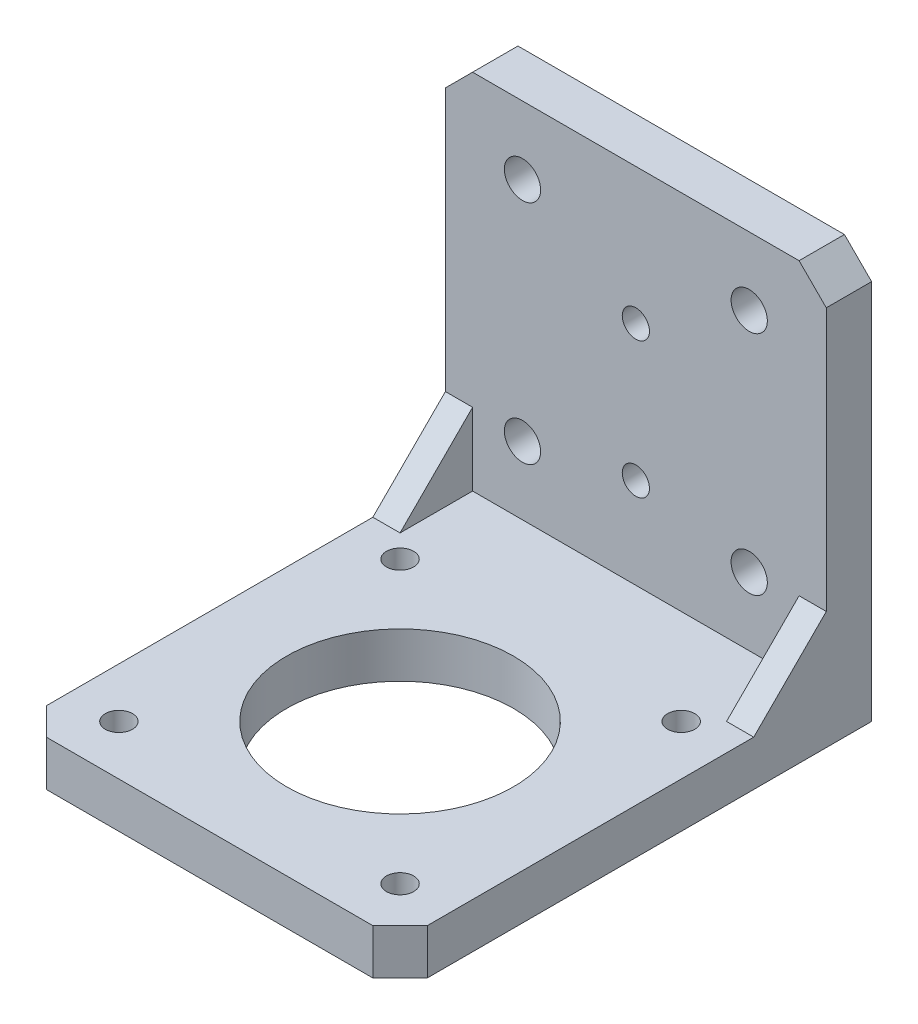
ISO-10303-21;
HEADER;
FILE_DESCRIPTION(('STEP AP214'),'2;1');
FILE_NAME('part.step','',(''),(''),'','','');
FILE_SCHEMA(('AUTOMOTIVE_DESIGN { 1 0 10303 214 1 1 1 1 }'));
ENDSEC;
DATA;
#1=APPLICATION_CONTEXT('core data for automotive mechanical design processes');
#2=APPLICATION_PROTOCOL_DEFINITION('international standard','automotive_design',2000,#1);
#3=PRODUCT_CONTEXT('',#1,'mechanical');
#4=PRODUCT('Part','Part','',(#3));
#5=PRODUCT_RELATED_PRODUCT_CATEGORY('part','',(#4));
#6=PRODUCT_DEFINITION_FORMATION('','',#4);
#7=PRODUCT_DEFINITION_CONTEXT('part definition',#1,'design');
#8=PRODUCT_DEFINITION('design','',#6,#7);
#9=PRODUCT_DEFINITION_SHAPE('','',#8);
#10=(LENGTH_UNIT() NAMED_UNIT(*) SI_UNIT(.MILLI.,.METRE.));
#11=(NAMED_UNIT(*) PLANE_ANGLE_UNIT() SI_UNIT($,.RADIAN.));
#12=(NAMED_UNIT(*) SI_UNIT($,.STERADIAN.) SOLID_ANGLE_UNIT());
#13=UNCERTAINTY_MEASURE_WITH_UNIT(LENGTH_MEASURE(1.E-05),#10,'distance_accuracy_value','');
#14=(GEOMETRIC_REPRESENTATION_CONTEXT(3) GLOBAL_UNCERTAINTY_ASSIGNED_CONTEXT((#13)) GLOBAL_UNIT_ASSIGNED_CONTEXT((#10,
#11,#12)) REPRESENTATION_CONTEXT('',''));
#15=CARTESIAN_POINT('',(0.,0.,0.));
#16=DIRECTION('',(0.,0.,1.));
#17=DIRECTION('',(1.,0.,0.));
#18=AXIS2_PLACEMENT_3D('',#15,#16,#17);
#19=CARTESIAN_POINT('',(21.,5.,23.5));
#20=DIRECTION('',(-1.,0.,0.));
#21=DIRECTION('',(0.,0.,1.));
#22=AXIS2_PLACEMENT_3D('',#19,#20,#21);
#23=PLANE('',#22);
#24=DIRECTION('',(0.,0.,-1.));
#25=VECTOR('',#24,1.);
#26=CARTESIAN_POINT('',(21.,5.,23.5));
#27=LINE('',#26,#25);
#28=CARTESIAN_POINT('',(21.,5.,20.5));
#29=VERTEX_POINT('',#28);
#30=CARTESIAN_POINT('',(21.,5.,-15.5));
#31=VERTEX_POINT('',#30);
#32=EDGE_CURVE('E165',#29,#31,#27,.T.);
#33=ORIENTED_EDGE('',*,*,#32,.F.);
#34=DIRECTION('',(0.,-1.,0.));
#35=VECTOR('',#34,1.);
#36=CARTESIAN_POINT('',(21.,5.,20.5));
#37=LINE('',#36,#35);
#38=CARTESIAN_POINT('',(21.,0.,20.5));
#39=VERTEX_POINT('',#38);
#40=EDGE_CURVE('E328',#29,#39,#37,.T.);
#41=ORIENTED_EDGE('',*,*,#40,.T.);
#42=DIRECTION('',(0.,0.,-1.));
#43=VECTOR('',#42,1.);
#44=CARTESIAN_POINT('',(21.,0.,23.5));
#45=LINE('',#44,#43);
#46=CARTESIAN_POINT('',(21.,0.,-28.5));
#47=VERTEX_POINT('',#46);
#48=EDGE_CURVE('E186',#39,#47,#45,.T.);
#49=ORIENTED_EDGE('',*,*,#48,.T.);
#50=DIRECTION('',(0.,-1.,0.));
#51=VECTOR('',#50,1.);
#52=CARTESIAN_POINT('',(21.,0.,-28.5));
#53=LINE('',#52,#51);
#54=CARTESIAN_POINT('',(21.,42.,-28.5));
#55=VERTEX_POINT('',#54);
#56=EDGE_CURVE('E226',#55,#47,#53,.T.);
#57=ORIENTED_EDGE('',*,*,#56,.F.);
#58=DIRECTION('',(0.,0.,1.));
#59=VECTOR('',#58,1.);
#60=CARTESIAN_POINT('',(21.,42.,23.5));
#61=LINE('',#60,#59);
#62=CARTESIAN_POINT('',(21.,42.,-23.5));
#63=VERTEX_POINT('',#62);
#64=EDGE_CURVE('E212',#55,#63,#61,.T.);
#65=ORIENTED_EDGE('',*,*,#64,.T.);
#66=DIRECTION('',(0.,-1.,0.));
#67=VECTOR('',#66,1.);
#68=CARTESIAN_POINT('',(21.,0.,-23.5));
#69=LINE('',#68,#67);
#70=CARTESIAN_POINT('',(21.,13.,-23.5));
#71=VERTEX_POINT('',#70);
#72=EDGE_CURVE('E213',#63,#71,#69,.T.);
#73=ORIENTED_EDGE('',*,*,#72,.T.);
#74=DIRECTION('',(0.,-0.707106781186547,0.707106781186548));
#75=VECTOR('',#74,1.);
#76=CARTESIAN_POINT('',(21.,13.,-23.5));
#77=LINE('',#76,#75);
#78=EDGE_CURVE('E344',#71,#31,#77,.T.);
#79=ORIENTED_EDGE('',*,*,#78,.T.);
#80=EDGE_LOOP('',(#33,#41,#49,#57,#65,#73,#79));
#81=FACE_BOUND('',#80,.T.);
#82=ADVANCED_FACE('F35',(#81),#23,.F.);
#83=CARTESIAN_POINT('',(-21.,5.,23.5));
#84=DIRECTION('',(1.,0.,0.));
#85=DIRECTION('',(0.,0.,-1.));
#86=AXIS2_PLACEMENT_3D('',#83,#84,#85);
#87=PLANE('',#86);
#88=DIRECTION('',(0.,0.,1.));
#89=VECTOR('',#88,1.);
#90=CARTESIAN_POINT('',(-21.,0.,23.5));
#91=LINE('',#90,#89);
#92=CARTESIAN_POINT('',(-21.,0.,-28.5));
#93=VERTEX_POINT('',#92);
#94=CARTESIAN_POINT('',(-21.,0.,20.5));
#95=VERTEX_POINT('',#94);
#96=EDGE_CURVE('E189',#93,#95,#91,.T.);
#97=ORIENTED_EDGE('',*,*,#96,.T.);
#98=DIRECTION('',(0.,1.,0.));
#99=VECTOR('',#98,1.);
#100=CARTESIAN_POINT('',(-21.,5.,20.5));
#101=LINE('',#100,#99);
#102=CARTESIAN_POINT('',(-21.,5.,20.5));
#103=VERTEX_POINT('',#102);
#104=EDGE_CURVE('E206',#95,#103,#101,.T.);
#105=ORIENTED_EDGE('',*,*,#104,.T.);
#106=DIRECTION('',(0.,0.,1.));
#107=VECTOR('',#106,1.);
#108=CARTESIAN_POINT('',(-21.,5.,23.5));
#109=LINE('',#108,#107);
#110=CARTESIAN_POINT('',(-21.,5.,-15.5));
#111=VERTEX_POINT('',#110);
#112=EDGE_CURVE('E164',#111,#103,#109,.T.);
#113=ORIENTED_EDGE('',*,*,#112,.F.);
#114=DIRECTION('',(0.,0.707106781186548,-0.707106781186548));
#115=VECTOR('',#114,1.);
#116=CARTESIAN_POINT('',(-21.,13.,-23.5));
#117=LINE('',#116,#115);
#118=CARTESIAN_POINT('',(-21.,13.,-23.5));
#119=VERTEX_POINT('',#118);
#120=EDGE_CURVE('E156',#111,#119,#117,.T.);
#121=ORIENTED_EDGE('',*,*,#120,.T.);
#122=DIRECTION('',(0.,1.,0.));
#123=VECTOR('',#122,1.);
#124=CARTESIAN_POINT('',(-21.,0.,-23.5));
#125=LINE('',#124,#123);
#126=CARTESIAN_POINT('',(-21.,42.,-23.5));
#127=VERTEX_POINT('',#126);
#128=EDGE_CURVE('E176',#119,#127,#125,.T.);
#129=ORIENTED_EDGE('',*,*,#128,.T.);
#130=DIRECTION('',(0.,0.,-1.));
#131=VECTOR('',#130,1.);
#132=CARTESIAN_POINT('',(-21.,42.,23.5));
#133=LINE('',#132,#131);
#134=CARTESIAN_POINT('',(-21.,42.,-28.5));
#135=VERTEX_POINT('',#134);
#136=EDGE_CURVE('E204',#127,#135,#133,.T.);
#137=ORIENTED_EDGE('',*,*,#136,.T.);
#138=DIRECTION('',(0.,1.,0.));
#139=VECTOR('',#138,1.);
#140=CARTESIAN_POINT('',(-21.,0.,-28.5));
#141=LINE('',#140,#139);
#142=EDGE_CURVE('E312',#93,#135,#141,.T.);
#143=ORIENTED_EDGE('',*,*,#142,.F.);
#144=EDGE_LOOP('',(#97,#105,#113,#121,#129,#137,#143));
#145=FACE_BOUND('',#144,.T.);
#146=ADVANCED_FACE('F269',(#145),#87,.F.);
#147=CARTESIAN_POINT('',(-21.,5.,23.5));
#148=DIRECTION('',(0.,0.,-1.));
#149=DIRECTION('',(-1.,0.,0.));
#150=AXIS2_PLACEMENT_3D('',#147,#148,#149);
#151=PLANE('',#150);
#152=DIRECTION('',(1.,0.,0.));
#153=VECTOR('',#152,1.);
#154=CARTESIAN_POINT('',(-21.,5.,23.5));
#155=LINE('',#154,#153);
#156=CARTESIAN_POINT('',(-18.,5.,23.5));
#157=VERTEX_POINT('',#156);
#158=CARTESIAN_POINT('',(18.,5.,23.5));
#159=VERTEX_POINT('',#158);
#160=EDGE_CURVE('E167',#157,#159,#155,.T.);
#161=ORIENTED_EDGE('',*,*,#160,.F.);
#162=DIRECTION('',(0.,-1.,0.));
#163=VECTOR('',#162,1.);
#164=CARTESIAN_POINT('',(-18.,5.,23.5));
#165=LINE('',#164,#163);
#166=CARTESIAN_POINT('',(-18.,0.,23.5));
#167=VERTEX_POINT('',#166);
#168=EDGE_CURVE('E197',#157,#167,#165,.T.);
#169=ORIENTED_EDGE('',*,*,#168,.T.);
#170=DIRECTION('',(1.,0.,0.));
#171=VECTOR('',#170,1.);
#172=CARTESIAN_POINT('',(-21.,0.,23.5));
#173=LINE('',#172,#171);
#174=CARTESIAN_POINT('',(18.,0.,23.5));
#175=VERTEX_POINT('',#174);
#176=EDGE_CURVE('E169',#167,#175,#173,.T.);
#177=ORIENTED_EDGE('',*,*,#176,.T.);
#178=DIRECTION('',(0.,1.,0.));
#179=VECTOR('',#178,1.);
#180=CARTESIAN_POINT('',(18.,5.,23.5));
#181=LINE('',#180,#179);
#182=EDGE_CURVE('E185',#175,#159,#181,.T.);
#183=ORIENTED_EDGE('',*,*,#182,.T.);
#184=EDGE_LOOP('',(#161,#169,#177,#183));
#185=FACE_BOUND('',#184,.T.);
#186=ADVANCED_FACE('F260',(#185),#151,.F.);
#187=CARTESIAN_POINT('',(0.,5.,0.));
#188=DIRECTION('',(0.,-1.,0.));
#189=DIRECTION('',(0.,0.,-1.));
#190=AXIS2_PLACEMENT_3D('',#187,#188,#189);
#191=PLANE('',#190);
#192=CARTESIAN_POINT('',(0.,5.,2.5));
#193=DIRECTION('',(0.,1.,0.));
#194=DIRECTION('',(0.,0.,1.));
#195=AXIS2_PLACEMENT_3D('',#192,#193,#194);
#196=CIRCLE('',#195,12.5);
#197=CARTESIAN_POINT('',(0.,5.,15.));
#198=VERTEX_POINT('',#197);
#199=EDGE_CURVE('E231',#198,#198,#196,.T.);
#200=ORIENTED_EDGE('',*,*,#199,.F.);
#201=EDGE_LOOP('',(#200));
#202=FACE_BOUND('',#201,.T.);
#203=CARTESIAN_POINT('',(-15.5,5.,18.));
#204=DIRECTION('',(0.,1.,0.));
#205=DIRECTION('',(0.,0.,1.));
#206=AXIS2_PLACEMENT_3D('',#203,#204,#205);
#207=CIRCLE('',#206,1.5);
#208=CARTESIAN_POINT('',(-15.5,5.,19.5));
#209=VERTEX_POINT('',#208);
#210=EDGE_CURVE('E230',#209,#209,#207,.T.);
#211=ORIENTED_EDGE('',*,*,#210,.F.);
#212=EDGE_LOOP('',(#211));
#213=FACE_BOUND('',#212,.T.);
#214=CARTESIAN_POINT('',(15.5,5.,18.));
#215=DIRECTION('',(0.,1.,0.));
#216=DIRECTION('',(0.,0.,1.));
#217=AXIS2_PLACEMENT_3D('',#214,#215,#216);
#218=CIRCLE('',#217,1.5);
#219=CARTESIAN_POINT('',(15.5,5.,19.5));
#220=VERTEX_POINT('',#219);
#221=EDGE_CURVE('E237',#220,#220,#218,.T.);
#222=ORIENTED_EDGE('',*,*,#221,.F.);
#223=EDGE_LOOP('',(#222));
#224=FACE_BOUND('',#223,.T.);
#225=CARTESIAN_POINT('',(15.5,5.,-13.));
#226=DIRECTION('',(0.,1.,0.));
#227=DIRECTION('',(0.,0.,1.));
#228=AXIS2_PLACEMENT_3D('',#225,#226,#227);
#229=CIRCLE('',#228,1.5);
#230=CARTESIAN_POINT('',(15.5,5.,-11.5));
#231=VERTEX_POINT('',#230);
#232=EDGE_CURVE('E243',#231,#231,#229,.T.);
#233=ORIENTED_EDGE('',*,*,#232,.F.);
#234=EDGE_LOOP('',(#233));
#235=FACE_BOUND('',#234,.T.);
#236=CARTESIAN_POINT('',(-15.5,5.,-13.));
#237=DIRECTION('',(0.,1.,0.));
#238=DIRECTION('',(0.,0.,1.));
#239=AXIS2_PLACEMENT_3D('',#236,#237,#238);
#240=CIRCLE('',#239,1.5);
#241=CARTESIAN_POINT('',(-15.5,5.,-11.5));
#242=VERTEX_POINT('',#241);
#243=EDGE_CURVE('E181',#242,#242,#240,.T.);
#244=ORIENTED_EDGE('',*,*,#243,.F.);
#245=EDGE_LOOP('',(#244));
#246=FACE_BOUND('',#245,.T.);
#247=ORIENTED_EDGE('',*,*,#112,.T.);
#248=DIRECTION('',(-0.707106781186548,0.,-0.707106781186548));
#249=VECTOR('',#248,1.);
#250=CARTESIAN_POINT('',(-18.,5.,23.5));
#251=LINE('',#250,#249);
#252=EDGE_CURVE('E210',#103,#157,#251,.F.);
#253=ORIENTED_EDGE('',*,*,#252,.T.);
#254=ORIENTED_EDGE('',*,*,#160,.T.);
#255=DIRECTION('',(-0.707106781186548,0.,0.707106781186548));
#256=VECTOR('',#255,1.);
#257=CARTESIAN_POINT('',(21.,5.,20.5));
#258=LINE('',#257,#256);
#259=EDGE_CURVE('E207',#159,#29,#258,.F.);
#260=ORIENTED_EDGE('',*,*,#259,.T.);
#261=ORIENTED_EDGE('',*,*,#32,.T.);
#262=DIRECTION('',(1.,0.,0.));
#263=VECTOR('',#262,1.);
#264=CARTESIAN_POINT('',(18.,5.,-15.5));
#265=LINE('',#264,#263);
#266=CARTESIAN_POINT('',(18.,5.,-15.5));
#267=VERTEX_POINT('',#266);
#268=EDGE_CURVE('E216',#267,#31,#265,.T.);
#269=ORIENTED_EDGE('',*,*,#268,.F.);
#270=DIRECTION('',(0.,0.,-1.));
#271=VECTOR('',#270,1.);
#272=CARTESIAN_POINT('',(18.,5.,-15.5));
#273=LINE('',#272,#271);
#274=CARTESIAN_POINT('',(18.,5.,-23.5));
#275=VERTEX_POINT('',#274);
#276=EDGE_CURVE('E163',#267,#275,#273,.T.);
#277=ORIENTED_EDGE('',*,*,#276,.T.);
#278=DIRECTION('',(-1.,0.,0.));
#279=VECTOR('',#278,1.);
#280=CARTESIAN_POINT('',(-21.,5.,-23.5));
#281=LINE('',#280,#279);
#282=CARTESIAN_POINT('',(-18.,5.,-23.5));
#283=VERTEX_POINT('',#282);
#284=EDGE_CURVE('E152',#275,#283,#281,.T.);
#285=ORIENTED_EDGE('',*,*,#284,.T.);
#286=DIRECTION('',(0.,0.,1.));
#287=VECTOR('',#286,1.);
#288=CARTESIAN_POINT('',(-18.,5.,-15.5));
#289=LINE('',#288,#287);
#290=CARTESIAN_POINT('',(-18.,5.,-15.5));
#291=VERTEX_POINT('',#290);
#292=EDGE_CURVE('E136',#283,#291,#289,.T.);
#293=ORIENTED_EDGE('',*,*,#292,.T.);
#294=DIRECTION('',(-1.,0.,0.));
#295=VECTOR('',#294,1.);
#296=CARTESIAN_POINT('',(-18.,5.,-15.5));
#297=LINE('',#296,#295);
#298=EDGE_CURVE('E351',#291,#111,#297,.T.);
#299=ORIENTED_EDGE('',*,*,#298,.T.);
#300=EDGE_LOOP('',(#247,#253,#254,#260,#261,#269,#277,#285,#293,#299));
#301=FACE_BOUND('',#300,.T.);
#302=ADVANCED_FACE('F160',(#202,#213,#224,#235,#246,#301),#191,.F.);
#303=CARTESIAN_POINT('',(0.,0.,0.));
#304=DIRECTION('',(0.,-1.,0.));
#305=DIRECTION('',(0.,0.,-1.));
#306=AXIS2_PLACEMENT_3D('',#303,#304,#305);
#307=PLANE('',#306);
#308=CARTESIAN_POINT('',(0.,0.,2.5));
#309=DIRECTION('',(0.,1.,0.));
#310=DIRECTION('',(0.,0.,1.));
#311=AXIS2_PLACEMENT_3D('',#308,#309,#310);
#312=CIRCLE('',#311,12.5);
#313=CARTESIAN_POINT('',(0.,0.,15.));
#314=VERTEX_POINT('',#313);
#315=EDGE_CURVE('E227',#314,#314,#312,.T.);
#316=ORIENTED_EDGE('',*,*,#315,.T.);
#317=EDGE_LOOP('',(#316));
#318=FACE_BOUND('',#317,.T.);
#319=CARTESIAN_POINT('',(-15.5,0.,18.));
#320=DIRECTION('',(0.,1.,0.));
#321=DIRECTION('',(0.,0.,1.));
#322=AXIS2_PLACEMENT_3D('',#319,#320,#321);
#323=CIRCLE('',#322,1.5);
#324=CARTESIAN_POINT('',(-15.5,0.,19.5));
#325=VERTEX_POINT('',#324);
#326=EDGE_CURVE('E234',#325,#325,#323,.T.);
#327=ORIENTED_EDGE('',*,*,#326,.T.);
#328=EDGE_LOOP('',(#327));
#329=FACE_BOUND('',#328,.T.);
#330=CARTESIAN_POINT('',(15.5,0.,18.));
#331=DIRECTION('',(0.,1.,0.));
#332=DIRECTION('',(0.,0.,1.));
#333=AXIS2_PLACEMENT_3D('',#330,#331,#332);
#334=CIRCLE('',#333,1.5);
#335=CARTESIAN_POINT('',(15.5,0.,19.5));
#336=VERTEX_POINT('',#335);
#337=EDGE_CURVE('E240',#336,#336,#334,.T.);
#338=ORIENTED_EDGE('',*,*,#337,.T.);
#339=EDGE_LOOP('',(#338));
#340=FACE_BOUND('',#339,.T.);
#341=CARTESIAN_POINT('',(15.5,0.,-13.));
#342=DIRECTION('',(0.,1.,0.));
#343=DIRECTION('',(0.,0.,1.));
#344=AXIS2_PLACEMENT_3D('',#341,#342,#343);
#345=CIRCLE('',#344,1.5);
#346=CARTESIAN_POINT('',(15.5,0.,-11.5));
#347=VERTEX_POINT('',#346);
#348=EDGE_CURVE('E246',#347,#347,#345,.T.);
#349=ORIENTED_EDGE('',*,*,#348,.T.);
#350=EDGE_LOOP('',(#349));
#351=FACE_BOUND('',#350,.T.);
#352=CARTESIAN_POINT('',(-15.5,0.,-13.));
#353=DIRECTION('',(0.,1.,0.));
#354=DIRECTION('',(0.,0.,1.));
#355=AXIS2_PLACEMENT_3D('',#352,#353,#354);
#356=CIRCLE('',#355,1.5);
#357=CARTESIAN_POINT('',(-15.5,0.,-11.5));
#358=VERTEX_POINT('',#357);
#359=EDGE_CURVE('E190',#358,#358,#356,.T.);
#360=ORIENTED_EDGE('',*,*,#359,.T.);
#361=EDGE_LOOP('',(#360));
#362=FACE_BOUND('',#361,.T.);
#363=ORIENTED_EDGE('',*,*,#176,.F.);
#364=DIRECTION('',(0.707106781186548,0.,0.707106781186548));
#365=VECTOR('',#364,1.);
#366=CARTESIAN_POINT('',(-20.75,0.,20.75));
#367=LINE('',#366,#365);
#368=EDGE_CURVE('E202',#167,#95,#367,.F.);
#369=ORIENTED_EDGE('',*,*,#368,.T.);
#370=ORIENTED_EDGE('',*,*,#96,.F.);
#371=DIRECTION('',(-1.,0.,0.));
#372=VECTOR('',#371,1.);
#373=CARTESIAN_POINT('',(21.,0.,-28.5));
#374=LINE('',#373,#372);
#375=EDGE_CURVE('E310',#47,#93,#374,.T.);
#376=ORIENTED_EDGE('',*,*,#375,.F.);
#377=ORIENTED_EDGE('',*,*,#48,.F.);
#378=DIRECTION('',(0.707106781186548,0.,-0.707106781186548));
#379=VECTOR('',#378,1.);
#380=CARTESIAN_POINT('',(20.75,0.,20.75));
#381=LINE('',#380,#379);
#382=EDGE_CURVE('E200',#39,#175,#381,.F.);
#383=ORIENTED_EDGE('',*,*,#382,.T.);
#384=EDGE_LOOP('',(#363,#369,#370,#376,#377,#383));
#385=FACE_BOUND('',#384,.T.);
#386=ADVANCED_FACE('F259',(#318,#329,#340,#351,#362,#385),#307,.T.);
#387=CARTESIAN_POINT('',(-15.5,0.,-13.));
#388=DIRECTION('',(0.,1.,0.));
#389=DIRECTION('',(0.,0.,1.));
#390=AXIS2_PLACEMENT_3D('',#387,#388,#389);
#391=CYLINDRICAL_SURFACE('',#390,1.5);
#392=ORIENTED_EDGE('',*,*,#359,.F.);
#393=EDGE_LOOP('',(#392));
#394=FACE_BOUND('',#393,.T.);
#395=ORIENTED_EDGE('',*,*,#243,.T.);
#396=EDGE_LOOP('',(#395));
#397=FACE_BOUND('',#396,.T.);
#398=ADVANCED_FACE('F256',(#394,#397),#391,.F.);
#399=CARTESIAN_POINT('',(15.5,0.,-13.));
#400=DIRECTION('',(0.,1.,0.));
#401=DIRECTION('',(0.,0.,1.));
#402=AXIS2_PLACEMENT_3D('',#399,#400,#401);
#403=CYLINDRICAL_SURFACE('',#402,1.5);
#404=ORIENTED_EDGE('',*,*,#348,.F.);
#405=EDGE_LOOP('',(#404));
#406=FACE_BOUND('',#405,.T.);
#407=ORIENTED_EDGE('',*,*,#232,.T.);
#408=EDGE_LOOP('',(#407));
#409=FACE_BOUND('',#408,.T.);
#410=ADVANCED_FACE('F441',(#406,#409),#403,.F.);
#411=CARTESIAN_POINT('',(15.5,0.,18.));
#412=DIRECTION('',(0.,1.,0.));
#413=DIRECTION('',(0.,0.,1.));
#414=AXIS2_PLACEMENT_3D('',#411,#412,#413);
#415=CYLINDRICAL_SURFACE('',#414,1.5);
#416=ORIENTED_EDGE('',*,*,#337,.F.);
#417=EDGE_LOOP('',(#416));
#418=FACE_BOUND('',#417,.T.);
#419=ORIENTED_EDGE('',*,*,#221,.T.);
#420=EDGE_LOOP('',(#419));
#421=FACE_BOUND('',#420,.T.);
#422=ADVANCED_FACE('F437',(#418,#421),#415,.F.);
#423=CARTESIAN_POINT('',(-15.5,0.,18.));
#424=DIRECTION('',(0.,1.,0.));
#425=DIRECTION('',(0.,0.,1.));
#426=AXIS2_PLACEMENT_3D('',#423,#424,#425);
#427=CYLINDRICAL_SURFACE('',#426,1.5);
#428=ORIENTED_EDGE('',*,*,#326,.F.);
#429=EDGE_LOOP('',(#428));
#430=FACE_BOUND('',#429,.T.);
#431=ORIENTED_EDGE('',*,*,#210,.T.);
#432=EDGE_LOOP('',(#431));
#433=FACE_BOUND('',#432,.T.);
#434=ADVANCED_FACE('F429',(#430,#433),#427,.F.);
#435=CARTESIAN_POINT('',(0.,0.,2.5));
#436=DIRECTION('',(0.,1.,0.));
#437=DIRECTION('',(0.,0.,1.));
#438=AXIS2_PLACEMENT_3D('',#435,#436,#437);
#439=CYLINDRICAL_SURFACE('',#438,12.5);
#440=ORIENTED_EDGE('',*,*,#315,.F.);
#441=EDGE_LOOP('',(#440));
#442=FACE_BOUND('',#441,.T.);
#443=ORIENTED_EDGE('',*,*,#199,.T.);
#444=EDGE_LOOP('',(#443));
#445=FACE_BOUND('',#444,.T.);
#446=ADVANCED_FACE('F420',(#442,#445),#439,.F.);
#447=CARTESIAN_POINT('',(0.,0.,-23.5));
#448=DIRECTION('',(0.,0.,1.));
#449=DIRECTION('',(1.,0.,0.));
#450=AXIS2_PLACEMENT_3D('',#447,#448,#449);
#451=PLANE('',#450);
#452=CARTESIAN_POINT('',(2.4980018054066E-13,15.0000000000007,-23.5));
#453=DIRECTION('',(0.,0.,1.));
#454=DIRECTION('',(1.,0.,0.));
#455=AXIS2_PLACEMENT_3D('',#452,#453,#454);
#456=CIRCLE('',#455,1.5);
#457=CARTESIAN_POINT('',(1.50000000000025,15.0000000000007,-23.5));
#458=VERTEX_POINT('',#457);
#459=EDGE_CURVE('E390',#458,#458,#456,.F.);
#460=ORIENTED_EDGE('',*,*,#459,.T.);
#461=EDGE_LOOP('',(#460));
#462=FACE_BOUND('',#461,.T.);
#463=CARTESIAN_POINT('',(1.97758476261356E-13,30.0000000000006,-23.5));
#464=DIRECTION('',(0.,0.,1.));
#465=DIRECTION('',(1.,0.,0.));
#466=AXIS2_PLACEMENT_3D('',#463,#464,#465);
#467=CIRCLE('',#466,1.5);
#468=CARTESIAN_POINT('',(1.5000000000002,30.0000000000006,-23.5));
#469=VERTEX_POINT('',#468);
#470=EDGE_CURVE('E384',#469,#469,#467,.F.);
#471=ORIENTED_EDGE('',*,*,#470,.T.);
#472=EDGE_LOOP('',(#471));
#473=FACE_BOUND('',#472,.T.);
#474=CARTESIAN_POINT('',(-12.5,12.5,-23.5));
#475=DIRECTION('',(0.,0.,1.));
#476=DIRECTION('',(1.,0.,0.));
#477=AXIS2_PLACEMENT_3D('',#474,#475,#476);
#478=CIRCLE('',#477,2.);
#479=CARTESIAN_POINT('',(-10.5,12.5,-23.5));
#480=VERTEX_POINT('',#479);
#481=EDGE_CURVE('E378',#480,#480,#478,.T.);
#482=ORIENTED_EDGE('',*,*,#481,.F.);
#483=EDGE_LOOP('',(#482));
#484=FACE_BOUND('',#483,.T.);
#485=CARTESIAN_POINT('',(12.5,12.5,-23.5));
#486=DIRECTION('',(0.,0.,1.));
#487=DIRECTION('',(1.,0.,0.));
#488=AXIS2_PLACEMENT_3D('',#485,#486,#487);
#489=CIRCLE('',#488,2.);
#490=CARTESIAN_POINT('',(14.5,12.5,-23.5));
#491=VERTEX_POINT('',#490);
#492=EDGE_CURVE('E372',#491,#491,#489,.T.);
#493=ORIENTED_EDGE('',*,*,#492,.F.);
#494=EDGE_LOOP('',(#493));
#495=FACE_BOUND('',#494,.T.);
#496=CARTESIAN_POINT('',(12.5,37.5,-23.5));
#497=DIRECTION('',(0.,0.,1.));
#498=DIRECTION('',(1.,0.,0.));
#499=AXIS2_PLACEMENT_3D('',#496,#497,#498);
#500=CIRCLE('',#499,2.);
#501=CARTESIAN_POINT('',(14.5,37.5,-23.5));
#502=VERTEX_POINT('',#501);
#503=EDGE_CURVE('E366',#502,#502,#500,.T.);
#504=ORIENTED_EDGE('',*,*,#503,.F.);
#505=EDGE_LOOP('',(#504));
#506=FACE_BOUND('',#505,.T.);
#507=CARTESIAN_POINT('',(-12.5,37.5,-23.5));
#508=DIRECTION('',(0.,0.,1.));
#509=DIRECTION('',(1.,0.,0.));
#510=AXIS2_PLACEMENT_3D('',#507,#508,#509);
#511=CIRCLE('',#510,2.);
#512=CARTESIAN_POINT('',(-10.5,37.5,-23.5));
#513=VERTEX_POINT('',#512);
#514=EDGE_CURVE('E360',#513,#513,#511,.T.);
#515=ORIENTED_EDGE('',*,*,#514,.F.);
#516=EDGE_LOOP('',(#515));
#517=FACE_BOUND('',#516,.T.);
#518=ORIENTED_EDGE('',*,*,#72,.F.);
#519=DIRECTION('',(0.70710678118655,-0.707106781186545,0.));
#520=VECTOR('',#519,1.);
#521=CARTESIAN_POINT('',(31.4999999999999,31.5000000000001,-23.5));
#522=LINE('',#521,#520);
#523=CARTESIAN_POINT('',(18.,45.,-23.5));
#524=VERTEX_POINT('',#523);
#525=EDGE_CURVE('E325',#63,#524,#522,.F.);
#526=ORIENTED_EDGE('',*,*,#525,.T.);
#527=DIRECTION('',(1.,0.,0.));
#528=VECTOR('',#527,1.);
#529=CARTESIAN_POINT('',(21.,45.,-23.5));
#530=LINE('',#529,#528);
#531=CARTESIAN_POINT('',(-18.,45.,-23.5));
#532=VERTEX_POINT('',#531);
#533=EDGE_CURVE('E224',#532,#524,#530,.T.);
#534=ORIENTED_EDGE('',*,*,#533,.F.);
#535=DIRECTION('',(0.707106781186547,0.707106781186548,0.));
#536=VECTOR('',#535,1.);
#537=CARTESIAN_POINT('',(-31.5,31.5,-23.5));
#538=LINE('',#537,#536);
#539=EDGE_CURVE('E327',#532,#127,#538,.F.);
#540=ORIENTED_EDGE('',*,*,#539,.T.);
#541=ORIENTED_EDGE('',*,*,#128,.F.);
#542=DIRECTION('',(-1.,0.,0.));
#543=VECTOR('',#542,1.);
#544=CARTESIAN_POINT('',(-18.,13.,-23.5));
#545=LINE('',#544,#543);
#546=CARTESIAN_POINT('',(-18.,13.,-23.5));
#547=VERTEX_POINT('',#546);
#548=EDGE_CURVE('E155',#547,#119,#545,.T.);
#549=ORIENTED_EDGE('',*,*,#548,.F.);
#550=DIRECTION('',(0.,-1.,0.));
#551=VECTOR('',#550,1.);
#552=CARTESIAN_POINT('',(-18.,5.,-23.5));
#553=LINE('',#552,#551);
#554=EDGE_CURVE('E139',#547,#283,#553,.T.);
#555=ORIENTED_EDGE('',*,*,#554,.T.);
#556=ORIENTED_EDGE('',*,*,#284,.F.);
#557=DIRECTION('',(0.,1.,0.));
#558=VECTOR('',#557,1.);
#559=CARTESIAN_POINT('',(18.,5.,-23.5));
#560=LINE('',#559,#558);
#561=CARTESIAN_POINT('',(18.,13.,-23.5));
#562=VERTEX_POINT('',#561);
#563=EDGE_CURVE('E348',#275,#562,#560,.T.);
#564=ORIENTED_EDGE('',*,*,#563,.T.);
#565=DIRECTION('',(1.,0.,0.));
#566=VECTOR('',#565,1.);
#567=CARTESIAN_POINT('',(18.,13.,-23.5));
#568=LINE('',#567,#566);
#569=EDGE_CURVE('E315',#562,#71,#568,.T.);
#570=ORIENTED_EDGE('',*,*,#569,.T.);
#571=EDGE_LOOP('',(#518,#526,#534,#540,#541,#549,#555,#556,#564,#570));
#572=FACE_BOUND('',#571,.T.);
#573=ADVANCED_FACE('F150',(#462,#473,#484,#495,#506,#517,#572),#451,.T.);
#574=CARTESIAN_POINT('',(21.,45.,-28.5));
#575=DIRECTION('',(0.,-1.,0.));
#576=DIRECTION('',(0.,0.,-1.));
#577=AXIS2_PLACEMENT_3D('',#574,#575,#576);
#578=PLANE('',#577);
#579=ORIENTED_EDGE('',*,*,#533,.T.);
#580=DIRECTION('',(0.,0.,-1.));
#581=VECTOR('',#580,1.);
#582=CARTESIAN_POINT('',(18.,45.,-28.5));
#583=LINE('',#582,#581);
#584=CARTESIAN_POINT('',(18.,45.,-28.5));
#585=VERTEX_POINT('',#584);
#586=EDGE_CURVE('E50',#524,#585,#583,.T.);
#587=ORIENTED_EDGE('',*,*,#586,.T.);
#588=DIRECTION('',(1.,0.,0.));
#589=VECTOR('',#588,1.);
#590=CARTESIAN_POINT('',(21.,45.,-28.5));
#591=LINE('',#590,#589);
#592=CARTESIAN_POINT('',(-18.,45.,-28.5));
#593=VERTEX_POINT('',#592);
#594=EDGE_CURVE('E220',#593,#585,#591,.T.);
#595=ORIENTED_EDGE('',*,*,#594,.F.);
#596=DIRECTION('',(0.,0.,1.));
#597=VECTOR('',#596,1.);
#598=CARTESIAN_POINT('',(-18.,45.,-28.5));
#599=LINE('',#598,#597);
#600=EDGE_CURVE('E321',#593,#532,#599,.T.);
#601=ORIENTED_EDGE('',*,*,#600,.T.);
#602=EDGE_LOOP('',(#579,#587,#595,#601));
#603=FACE_BOUND('',#602,.T.);
#604=ADVANCED_FACE('F400',(#603),#578,.F.);
#605=CARTESIAN_POINT('',(0.,0.,-28.5));
#606=DIRECTION('',(0.,0.,1.));
#607=DIRECTION('',(1.,0.,0.));
#608=AXIS2_PLACEMENT_3D('',#605,#606,#607);
#609=PLANE('',#608);
#610=CARTESIAN_POINT('',(2.4980018054066E-13,15.0000000000007,-28.5));
#611=DIRECTION('',(0.,0.,-1.));
#612=DIRECTION('',(-1.,0.,0.));
#613=AXIS2_PLACEMENT_3D('',#610,#611,#612);
#614=CIRCLE('',#613,1.5);
#615=CARTESIAN_POINT('',(-1.49999999999975,15.0000000000007,-28.5));
#616=VERTEX_POINT('',#615);
#617=EDGE_CURVE('E387',#616,#616,#614,.T.);
#618=ORIENTED_EDGE('',*,*,#617,.F.);
#619=EDGE_LOOP('',(#618));
#620=FACE_BOUND('',#619,.T.);
#621=CARTESIAN_POINT('',(1.97758476261356E-13,30.0000000000006,-28.5));
#622=DIRECTION('',(0.,0.,-1.));
#623=DIRECTION('',(-1.,0.,0.));
#624=AXIS2_PLACEMENT_3D('',#621,#622,#623);
#625=CIRCLE('',#624,1.5);
#626=CARTESIAN_POINT('',(-1.4999999999998,30.0000000000006,-28.5));
#627=VERTEX_POINT('',#626);
#628=EDGE_CURVE('E381',#627,#627,#625,.T.);
#629=ORIENTED_EDGE('',*,*,#628,.F.);
#630=EDGE_LOOP('',(#629));
#631=FACE_BOUND('',#630,.T.);
#632=CARTESIAN_POINT('',(-12.5,12.5,-28.5));
#633=DIRECTION('',(0.,0.,1.));
#634=DIRECTION('',(1.,0.,0.));
#635=AXIS2_PLACEMENT_3D('',#632,#633,#634);
#636=CIRCLE('',#635,2.);
#637=CARTESIAN_POINT('',(-10.5,12.5,-28.5));
#638=VERTEX_POINT('',#637);
#639=EDGE_CURVE('E375',#638,#638,#636,.T.);
#640=ORIENTED_EDGE('',*,*,#639,.T.);
#641=EDGE_LOOP('',(#640));
#642=FACE_BOUND('',#641,.T.);
#643=CARTESIAN_POINT('',(12.5,12.5,-28.5));
#644=DIRECTION('',(0.,0.,1.));
#645=DIRECTION('',(1.,0.,0.));
#646=AXIS2_PLACEMENT_3D('',#643,#644,#645);
#647=CIRCLE('',#646,2.);
#648=CARTESIAN_POINT('',(14.5,12.5,-28.5));
#649=VERTEX_POINT('',#648);
#650=EDGE_CURVE('E369',#649,#649,#647,.T.);
#651=ORIENTED_EDGE('',*,*,#650,.T.);
#652=EDGE_LOOP('',(#651));
#653=FACE_BOUND('',#652,.T.);
#654=CARTESIAN_POINT('',(12.5,37.5,-28.5));
#655=DIRECTION('',(0.,0.,1.));
#656=DIRECTION('',(1.,0.,0.));
#657=AXIS2_PLACEMENT_3D('',#654,#655,#656);
#658=CIRCLE('',#657,2.);
#659=CARTESIAN_POINT('',(14.5,37.5,-28.5));
#660=VERTEX_POINT('',#659);
#661=EDGE_CURVE('E363',#660,#660,#658,.T.);
#662=ORIENTED_EDGE('',*,*,#661,.T.);
#663=EDGE_LOOP('',(#662));
#664=FACE_BOUND('',#663,.T.);
#665=CARTESIAN_POINT('',(-12.5,37.5,-28.5));
#666=DIRECTION('',(0.,0.,1.));
#667=DIRECTION('',(1.,0.,0.));
#668=AXIS2_PLACEMENT_3D('',#665,#666,#667);
#669=CIRCLE('',#668,2.);
#670=CARTESIAN_POINT('',(-10.5,37.5,-28.5));
#671=VERTEX_POINT('',#670);
#672=EDGE_CURVE('E358',#671,#671,#669,.T.);
#673=ORIENTED_EDGE('',*,*,#672,.T.);
#674=EDGE_LOOP('',(#673));
#675=FACE_BOUND('',#674,.T.);
#676=ORIENTED_EDGE('',*,*,#594,.T.);
#677=DIRECTION('',(-0.70710678118655,0.707106781186545,0.));
#678=VECTOR('',#677,1.);
#679=CARTESIAN_POINT('',(21.,42.,-28.5));
#680=LINE('',#679,#678);
#681=EDGE_CURVE('E11',#585,#55,#680,.F.);
#682=ORIENTED_EDGE('',*,*,#681,.T.);
#683=ORIENTED_EDGE('',*,*,#56,.T.);
#684=ORIENTED_EDGE('',*,*,#375,.T.);
#685=ORIENTED_EDGE('',*,*,#142,.T.);
#686=DIRECTION('',(-0.707106781186547,-0.707106781186548,0.));
#687=VECTOR('',#686,1.);
#688=CARTESIAN_POINT('',(-18.,45.,-28.5));
#689=LINE('',#688,#687);
#690=EDGE_CURVE('E43',#135,#593,#689,.F.);
#691=ORIENTED_EDGE('',*,*,#690,.T.);
#692=EDGE_LOOP('',(#676,#682,#683,#684,#685,#691));
#693=FACE_BOUND('',#692,.T.);
#694=ADVANCED_FACE('F305',(#620,#631,#642,#653,#664,#675,#693),#609,.F.);
#695=CARTESIAN_POINT('',(18.,13.,-23.5));
#696=DIRECTION('',(0.,0.707106781186548,0.707106781186547));
#697=DIRECTION('',(0.,-0.707106781186547,0.707106781186548));
#698=AXIS2_PLACEMENT_3D('',#695,#696,#697);
#699=PLANE('',#698);
#700=ORIENTED_EDGE('',*,*,#78,.F.);
#701=ORIENTED_EDGE('',*,*,#569,.F.);
#702=DIRECTION('',(0.,-0.707106781186547,0.707106781186548));
#703=VECTOR('',#702,1.);
#704=CARTESIAN_POINT('',(18.,13.,-23.5));
#705=LINE('',#704,#703);
#706=EDGE_CURVE('E347',#562,#267,#705,.T.);
#707=ORIENTED_EDGE('',*,*,#706,.T.);
#708=ORIENTED_EDGE('',*,*,#268,.T.);
#709=EDGE_LOOP('',(#700,#701,#707,#708));
#710=FACE_BOUND('',#709,.T.);
#711=ADVANCED_FACE('F343',(#710),#699,.T.);
#712=CARTESIAN_POINT('',(18.,0.,0.));
#713=DIRECTION('',(-1.,0.,0.));
#714=DIRECTION('',(0.,0.,1.));
#715=AXIS2_PLACEMENT_3D('',#712,#713,#714);
#716=PLANE('',#715);
#717=ORIENTED_EDGE('',*,*,#563,.F.);
#718=ORIENTED_EDGE('',*,*,#276,.F.);
#719=ORIENTED_EDGE('',*,*,#706,.F.);
#720=EDGE_LOOP('',(#717,#718,#719));
#721=FACE_BOUND('',#720,.T.);
#722=ADVANCED_FACE('F491',(#721),#716,.T.);
#723=CARTESIAN_POINT('',(-18.,13.,-23.5));
#724=DIRECTION('',(0.,0.707106781186547,0.707106781186547));
#725=DIRECTION('',(0.,-0.707106781186548,0.707106781186548));
#726=AXIS2_PLACEMENT_3D('',#723,#724,#725);
#727=PLANE('',#726);
#728=ORIENTED_EDGE('',*,*,#120,.F.);
#729=ORIENTED_EDGE('',*,*,#298,.F.);
#730=DIRECTION('',(0.,0.707106781186548,-0.707106781186548));
#731=VECTOR('',#730,1.);
#732=CARTESIAN_POINT('',(-18.,13.,-23.5));
#733=LINE('',#732,#731);
#734=EDGE_CURVE('E141',#291,#547,#733,.T.);
#735=ORIENTED_EDGE('',*,*,#734,.T.);
#736=ORIENTED_EDGE('',*,*,#548,.T.);
#737=EDGE_LOOP('',(#728,#729,#735,#736));
#738=FACE_BOUND('',#737,.T.);
#739=ADVANCED_FACE('F497',(#738),#727,.T.);
#740=CARTESIAN_POINT('',(-18.,0.,0.));
#741=DIRECTION('',(-1.,0.,0.));
#742=DIRECTION('',(0.,0.,1.));
#743=AXIS2_PLACEMENT_3D('',#740,#741,#742);
#744=PLANE('',#743);
#745=ORIENTED_EDGE('',*,*,#554,.F.);
#746=ORIENTED_EDGE('',*,*,#734,.F.);
#747=ORIENTED_EDGE('',*,*,#292,.F.);
#748=EDGE_LOOP('',(#745,#746,#747));
#749=FACE_BOUND('',#748,.T.);
#750=ADVANCED_FACE('F138',(#749),#744,.F.);
#751=CARTESIAN_POINT('',(-12.5,37.5,-28.5));
#752=DIRECTION('',(0.,0.,1.));
#753=DIRECTION('',(1.,0.,0.));
#754=AXIS2_PLACEMENT_3D('',#751,#752,#753);
#755=CYLINDRICAL_SURFACE('',#754,2.);
#756=ORIENTED_EDGE('',*,*,#672,.F.);
#757=EDGE_LOOP('',(#756));
#758=FACE_BOUND('',#757,.T.);
#759=ORIENTED_EDGE('',*,*,#514,.T.);
#760=EDGE_LOOP('',(#759));
#761=FACE_BOUND('',#760,.T.);
#762=ADVANCED_FACE('F412',(#758,#761),#755,.F.);
#763=CARTESIAN_POINT('',(12.5,37.5,-28.5));
#764=DIRECTION('',(0.,0.,1.));
#765=DIRECTION('',(1.,0.,0.));
#766=AXIS2_PLACEMENT_3D('',#763,#764,#765);
#767=CYLINDRICAL_SURFACE('',#766,2.);
#768=ORIENTED_EDGE('',*,*,#661,.F.);
#769=EDGE_LOOP('',(#768));
#770=FACE_BOUND('',#769,.T.);
#771=ORIENTED_EDGE('',*,*,#503,.T.);
#772=EDGE_LOOP('',(#771));
#773=FACE_BOUND('',#772,.T.);
#774=ADVANCED_FACE('F415',(#770,#773),#767,.F.);
#775=CARTESIAN_POINT('',(12.5,12.5,-28.5));
#776=DIRECTION('',(0.,0.,1.));
#777=DIRECTION('',(1.,0.,0.));
#778=AXIS2_PLACEMENT_3D('',#775,#776,#777);
#779=CYLINDRICAL_SURFACE('',#778,2.);
#780=ORIENTED_EDGE('',*,*,#650,.F.);
#781=EDGE_LOOP('',(#780));
#782=FACE_BOUND('',#781,.T.);
#783=ORIENTED_EDGE('',*,*,#492,.T.);
#784=EDGE_LOOP('',(#783));
#785=FACE_BOUND('',#784,.T.);
#786=ADVANCED_FACE('F522',(#782,#785),#779,.F.);
#787=CARTESIAN_POINT('',(-12.5,12.5,-28.5));
#788=DIRECTION('',(0.,0.,1.));
#789=DIRECTION('',(1.,0.,0.));
#790=AXIS2_PLACEMENT_3D('',#787,#788,#789);
#791=CYLINDRICAL_SURFACE('',#790,2.);
#792=ORIENTED_EDGE('',*,*,#639,.F.);
#793=EDGE_LOOP('',(#792));
#794=FACE_BOUND('',#793,.T.);
#795=ORIENTED_EDGE('',*,*,#481,.T.);
#796=EDGE_LOOP('',(#795));
#797=FACE_BOUND('',#796,.T.);
#798=ADVANCED_FACE('F289',(#794,#797),#791,.F.);
#799=CARTESIAN_POINT('',(-18.,5.,23.5));
#800=DIRECTION('',(0.707106781186547,0.,-0.707106781186547));
#801=DIRECTION('',(0.,-1.,0.));
#802=AXIS2_PLACEMENT_3D('',#799,#800,#801);
#803=PLANE('',#802);
#804=ORIENTED_EDGE('',*,*,#252,.F.);
#805=ORIENTED_EDGE('',*,*,#104,.F.);
#806=ORIENTED_EDGE('',*,*,#368,.F.);
#807=ORIENTED_EDGE('',*,*,#168,.F.);
#808=EDGE_LOOP('',(#804,#805,#806,#807));
#809=FACE_BOUND('',#808,.T.);
#810=ADVANCED_FACE('F285',(#809),#803,.F.);
#811=CARTESIAN_POINT('',(21.,5.,20.5));
#812=DIRECTION('',(-0.707106781186547,0.,-0.707106781186547));
#813=DIRECTION('',(0.,-1.,0.));
#814=AXIS2_PLACEMENT_3D('',#811,#812,#813);
#815=PLANE('',#814);
#816=ORIENTED_EDGE('',*,*,#259,.F.);
#817=ORIENTED_EDGE('',*,*,#182,.F.);
#818=ORIENTED_EDGE('',*,*,#382,.F.);
#819=ORIENTED_EDGE('',*,*,#40,.F.);
#820=EDGE_LOOP('',(#816,#817,#818,#819));
#821=FACE_BOUND('',#820,.T.);
#822=ADVANCED_FACE('F288',(#821),#815,.F.);
#823=CARTESIAN_POINT('',(21.,42.,23.5));
#824=DIRECTION('',(-0.707106781186545,-0.70710678118655,0.));
#825=DIRECTION('',(0.,0.,1.));
#826=AXIS2_PLACEMENT_3D('',#823,#824,#825);
#827=PLANE('',#826);
#828=ORIENTED_EDGE('',*,*,#681,.F.);
#829=ORIENTED_EDGE('',*,*,#586,.F.);
#830=ORIENTED_EDGE('',*,*,#525,.F.);
#831=ORIENTED_EDGE('',*,*,#64,.F.);
#832=EDGE_LOOP('',(#828,#829,#830,#831));
#833=FACE_BOUND('',#832,.T.);
#834=ADVANCED_FACE('F292',(#833),#827,.F.);
#835=CARTESIAN_POINT('',(-18.,45.,-28.5));
#836=DIRECTION('',(0.707106781186548,-0.707106781186547,0.));
#837=DIRECTION('',(0.,0.,1.));
#838=AXIS2_PLACEMENT_3D('',#835,#836,#837);
#839=PLANE('',#838);
#840=ORIENTED_EDGE('',*,*,#690,.F.);
#841=ORIENTED_EDGE('',*,*,#136,.F.);
#842=ORIENTED_EDGE('',*,*,#539,.F.);
#843=ORIENTED_EDGE('',*,*,#600,.F.);
#844=EDGE_LOOP('',(#840,#841,#842,#843));
#845=FACE_BOUND('',#844,.T.);
#846=ADVANCED_FACE('F37',(#845),#839,.F.);
#847=CARTESIAN_POINT('',(1.97758476261356E-13,30.0000000000006,23.501));
#848=DIRECTION('',(0.,0.,-1.));
#849=DIRECTION('',(-1.,0.,0.));
#850=AXIS2_PLACEMENT_3D('',#847,#848,#849);
#851=CYLINDRICAL_SURFACE('',#850,1.5);
#852=ORIENTED_EDGE('',*,*,#470,.F.);
#853=EDGE_LOOP('',(#852));
#854=FACE_BOUND('',#853,.T.);
#855=ORIENTED_EDGE('',*,*,#628,.T.);
#856=EDGE_LOOP('',(#855));
#857=FACE_BOUND('',#856,.T.);
#858=ADVANCED_FACE('F299',(#854,#857),#851,.F.);
#859=CARTESIAN_POINT('',(2.4980018054066E-13,15.0000000000007,23.501));
#860=DIRECTION('',(0.,0.,-1.));
#861=DIRECTION('',(-1.,0.,0.));
#862=AXIS2_PLACEMENT_3D('',#859,#860,#861);
#863=CYLINDRICAL_SURFACE('',#862,1.5);
#864=ORIENTED_EDGE('',*,*,#459,.F.);
#865=EDGE_LOOP('',(#864));
#866=FACE_BOUND('',#865,.T.);
#867=ORIENTED_EDGE('',*,*,#617,.T.);
#868=EDGE_LOOP('',(#867));
#869=FACE_BOUND('',#868,.T.);
#870=ADVANCED_FACE('F396',(#866,#869),#863,.F.);
#871=CLOSED_SHELL('',(#82,#146,#186,#302,#386,#398,#410,#422,#434,#446,#573,#604,#694,#711,#722,
#739,#750,#762,#774,#786,#798,#810,#822,#834,#846,#858,#870));
#872=MANIFOLD_SOLID_BREP('B2',#871);
#873=ADVANCED_BREP_SHAPE_REPRESENTATION('',(#18,#872),#14);
#874=SHAPE_DEFINITION_REPRESENTATION(#9,#873);
ENDSEC;
END-ISO-10303-21;
